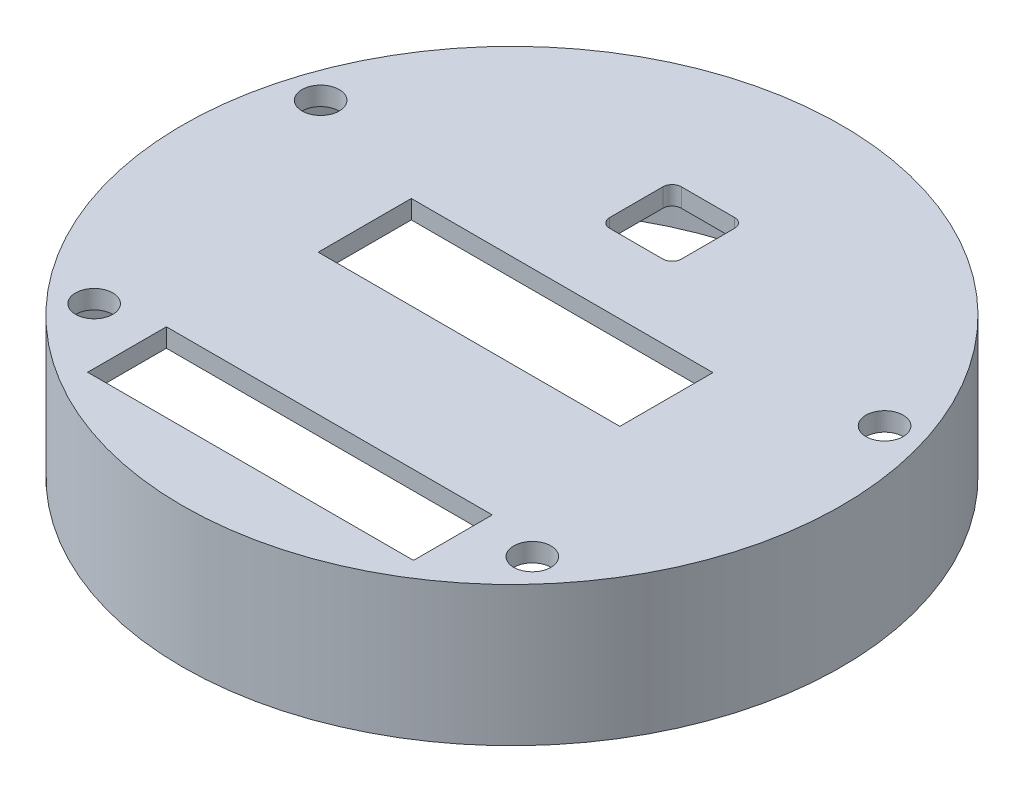
ISO-10303-21;
HEADER;
FILE_DESCRIPTION(('STEP AP214'),'2;1');
FILE_NAME('part.step','',(''),(''),'','','');
FILE_SCHEMA(('AUTOMOTIVE_DESIGN { 1 0 10303 214 1 1 1 1 }'));
ENDSEC;
DATA;
#1=APPLICATION_CONTEXT('core data for automotive mechanical design processes');
#2=APPLICATION_PROTOCOL_DEFINITION('international standard','automotive_design',2000,#1);
#3=PRODUCT_CONTEXT('',#1,'mechanical');
#4=PRODUCT('Part','Part','',(#3));
#5=PRODUCT_RELATED_PRODUCT_CATEGORY('part','',(#4));
#6=PRODUCT_DEFINITION_FORMATION('','',#4);
#7=PRODUCT_DEFINITION_CONTEXT('part definition',#1,'design');
#8=PRODUCT_DEFINITION('design','',#6,#7);
#9=PRODUCT_DEFINITION_SHAPE('','',#8);
#10=(LENGTH_UNIT() NAMED_UNIT(*) SI_UNIT(.MILLI.,.METRE.));
#11=(NAMED_UNIT(*) PLANE_ANGLE_UNIT() SI_UNIT($,.RADIAN.));
#12=(NAMED_UNIT(*) SI_UNIT($,.STERADIAN.) SOLID_ANGLE_UNIT());
#13=UNCERTAINTY_MEASURE_WITH_UNIT(LENGTH_MEASURE(1.E-05),#10,'distance_accuracy_value','');
#14=(GEOMETRIC_REPRESENTATION_CONTEXT(3) GLOBAL_UNCERTAINTY_ASSIGNED_CONTEXT((#13)) GLOBAL_UNIT_ASSIGNED_CONTEXT((#10,
#11,#12)) REPRESENTATION_CONTEXT('',''));
#15=CARTESIAN_POINT('',(0.,0.,0.));
#16=DIRECTION('',(0.,0.,1.));
#17=DIRECTION('',(1.,0.,0.));
#18=AXIS2_PLACEMENT_3D('',#15,#16,#17);
#19=CARTESIAN_POINT('',(0.,10.,0.));
#20=DIRECTION('',(0.,1.,0.));
#21=DIRECTION('',(0.,0.,1.));
#22=AXIS2_PLACEMENT_3D('',#19,#20,#21);
#23=PLANE('',#22);
#24=CARTESIAN_POINT('',(-14.2980458649045,10.,-71.7440671662427));
#25=DIRECTION('',(0.,-1.,0.));
#26=DIRECTION('',(0.,0.,-1.));
#27=AXIS2_PLACEMENT_3D('',#24,#25,#26);
#28=CIRCLE('',#27,4.99695413509549);
#29=CARTESIAN_POINT('',(-14.2980458649045,10.,-66.7471130311473));
#30=VERTEX_POINT('',#29);
#31=CARTESIAN_POINT('',(-19.295,10.,-71.7440671662427));
#32=VERTEX_POINT('',#31);
#33=EDGE_CURVE('E154',#30,#32,#28,.T.);
#34=ORIENTED_EDGE('',*,*,#33,.T.);
#35=DIRECTION('',(0.,0.,-1.));
#36=VECTOR('',#35,1.);
#37=CARTESIAN_POINT('',(-19.295,10.,-71.7440671662427));
#38=LINE('',#37,#36);
#39=CARTESIAN_POINT('',(-19.295,10.,-100.341395165584));
#40=VERTEX_POINT('',#39);
#41=EDGE_CURVE('E163',#32,#40,#38,.T.);
#42=ORIENTED_EDGE('',*,*,#41,.T.);
#43=CARTESIAN_POINT('',(-14.2992819814699,10.,-100.341395165584));
#44=DIRECTION('',(0.,-1.,0.));
#45=DIRECTION('',(0.,0.,-1.));
#46=AXIS2_PLACEMENT_3D('',#43,#44,#45);
#47=CIRCLE('',#46,4.99571801853014);
#48=CARTESIAN_POINT('',(-14.2980457119373,10.,-105.337113031147));
#49=VERTEX_POINT('',#48);
#50=EDGE_CURVE('E54',#40,#49,#47,.T.);
#51=ORIENTED_EDGE('',*,*,#50,.T.);
#52=DIRECTION('',(1.,0.,0.));
#53=VECTOR('',#52,1.);
#54=CARTESIAN_POINT('',(14.2993054193163,10.,-105.337113031147));
#55=LINE('',#54,#53);
#56=CARTESIAN_POINT('',(14.2993054193163,10.,-105.337113031147));
#57=VERTEX_POINT('',#56);
#58=EDGE_CURVE('E180',#49,#57,#55,.T.);
#59=ORIENTED_EDGE('',*,*,#58,.T.);
#60=CARTESIAN_POINT('',(14.299305266309,10.,-100.34141813875));
#61=DIRECTION('',(0.,-1.,0.));
#62=DIRECTION('',(0.,0.,1.));
#63=AXIS2_PLACEMENT_3D('',#60,#61,#62);
#64=CIRCLE('',#63,4.99569489239685);
#65=CARTESIAN_POINT('',(19.295,10.,-100.340158896052));
#66=VERTEX_POINT('',#65);
#67=EDGE_CURVE('E183',#57,#66,#64,.T.);
#68=ORIENTED_EDGE('',*,*,#67,.T.);
#69=DIRECTION('',(0.,0.,1.));
#70=VECTOR('',#69,1.);
#71=CARTESIAN_POINT('',(19.295,10.,-71.7440671662427));
#72=LINE('',#71,#70);
#73=CARTESIAN_POINT('',(19.295,10.,-71.7440671662427));
#74=VERTEX_POINT('',#73);
#75=EDGE_CURVE('E186',#66,#74,#72,.T.);
#76=ORIENTED_EDGE('',*,*,#75,.T.);
#77=CARTESIAN_POINT('',(14.2980458649045,10.,-71.7440671662427));
#78=DIRECTION('',(0.,-1.,0.));
#79=DIRECTION('',(0.,0.,1.));
#80=AXIS2_PLACEMENT_3D('',#77,#78,#79);
#81=CIRCLE('',#80,4.99695413509549);
#82=CARTESIAN_POINT('',(14.2980458649045,10.,-66.7471130311473));
#83=VERTEX_POINT('',#82);
#84=EDGE_CURVE('E189',#74,#83,#81,.T.);
#85=ORIENTED_EDGE('',*,*,#84,.T.);
#86=DIRECTION('',(-1.,0.,0.));
#87=VECTOR('',#86,1.);
#88=CARTESIAN_POINT('',(-14.2980458649045,10.,-66.7471130311473));
#89=LINE('',#88,#87);
#90=EDGE_CURVE('E160',#83,#30,#89,.T.);
#91=ORIENTED_EDGE('',*,*,#90,.T.);
#92=EDGE_LOOP('',(#34,#42,#51,#59,#68,#76,#85,#91));
#93=FACE_BOUND('',#92,.T.);
#94=CARTESIAN_POINT('',(-151.426262726326,10.,-48.6932363126054));
#95=DIRECTION('',(0.,-1.,0.));
#96=DIRECTION('',(0.,0.,-1.));
#97=AXIS2_PLACEMENT_3D('',#94,#95,#96);
#98=CIRCLE('',#97,10.);
#99=CARTESIAN_POINT('',(-151.426262726326,10.,-58.6932363126054));
#100=VERTEX_POINT('',#99);
#101=EDGE_CURVE('E275',#100,#100,#98,.T.);
#102=ORIENTED_EDGE('',*,*,#101,.T.);
#103=EDGE_LOOP('',(#102));
#104=FACE_BOUND('',#103,.T.);
#105=CARTESIAN_POINT('',(151.426262726326,10.,-48.6932363126054));
#106=DIRECTION('',(0.,-1.,0.));
#107=DIRECTION('',(0.,0.,-1.));
#108=AXIS2_PLACEMENT_3D('',#105,#106,#107);
#109=CIRCLE('',#108,10.);
#110=CARTESIAN_POINT('',(151.426262726326,10.,-58.6932363126054));
#111=VERTEX_POINT('',#110);
#112=EDGE_CURVE('E269',#111,#111,#109,.T.);
#113=ORIENTED_EDGE('',*,*,#112,.T.);
#114=EDGE_LOOP('',(#113));
#115=FACE_BOUND('',#114,.T.);
#116=CARTESIAN_POINT('',(117.665653331604,10.,106.7048628131));
#117=DIRECTION('',(0.,-1.,0.));
#118=DIRECTION('',(0.,0.,-1.));
#119=AXIS2_PLACEMENT_3D('',#116,#117,#118);
#120=CIRCLE('',#119,10.);
#121=CARTESIAN_POINT('',(117.665653331604,10.,96.7048628130998));
#122=VERTEX_POINT('',#121);
#123=EDGE_CURVE('E263',#122,#122,#120,.T.);
#124=ORIENTED_EDGE('',*,*,#123,.T.);
#125=EDGE_LOOP('',(#124));
#126=FACE_BOUND('',#125,.T.);
#127=CARTESIAN_POINT('',(-117.665653331604,10.,106.7048628131));
#128=DIRECTION('',(0.,-1.,0.));
#129=DIRECTION('',(0.,0.,-1.));
#130=AXIS2_PLACEMENT_3D('',#127,#128,#129);
#131=CIRCLE('',#130,9.99999999999999);
#132=CARTESIAN_POINT('',(-117.665653331604,10.,96.7048628130998));
#133=VERTEX_POINT('',#132);
#134=EDGE_CURVE('E241',#133,#133,#131,.T.);
#135=ORIENTED_EDGE('',*,*,#134,.T.);
#136=EDGE_LOOP('',(#135));
#137=FACE_BOUND('',#136,.T.);
#138=DIRECTION('',(0.,0.,-1.));
#139=VECTOR('',#138,1.);
#140=CARTESIAN_POINT('',(-87.5,10.,98.076429650903));
#141=LINE('',#140,#139);
#142=CARTESIAN_POINT('',(-87.5,10.,140.373739502711));
#143=VERTEX_POINT('',#142);
#144=CARTESIAN_POINT('',(-87.5,10.,98.076429650903));
#145=VERTEX_POINT('',#144);
#146=EDGE_CURVE('E224',#143,#145,#141,.T.);
#147=ORIENTED_EDGE('',*,*,#146,.T.);
#148=DIRECTION('',(1.,0.,0.));
#149=VECTOR('',#148,1.);
#150=CARTESIAN_POINT('',(-87.5,10.,98.076429650903));
#151=LINE('',#150,#149);
#152=CARTESIAN_POINT('',(87.5000000000001,10.,98.076429650903));
#153=VERTEX_POINT('',#152);
#154=EDGE_CURVE('E227',#145,#153,#151,.T.);
#155=ORIENTED_EDGE('',*,*,#154,.T.);
#156=DIRECTION('',(0.,0.,1.));
#157=VECTOR('',#156,1.);
#158=CARTESIAN_POINT('',(87.5000000000001,10.,98.076429650903));
#159=LINE('',#158,#157);
#160=CARTESIAN_POINT('',(87.5000000000001,10.,140.373739502711));
#161=VERTEX_POINT('',#160);
#162=EDGE_CURVE('E231',#153,#161,#159,.T.);
#163=ORIENTED_EDGE('',*,*,#162,.T.);
#164=DIRECTION('',(-1.,0.,0.));
#165=VECTOR('',#164,1.);
#166=CARTESIAN_POINT('',(-87.5,10.,140.373739502711));
#167=LINE('',#166,#165);
#168=EDGE_CURVE('E234',#161,#143,#167,.T.);
#169=ORIENTED_EDGE('',*,*,#168,.T.);
#170=EDGE_LOOP('',(#147,#155,#163,#169));
#171=FACE_BOUND('',#170,.T.);
#172=DIRECTION('',(0.,0.,-1.));
#173=VECTOR('',#172,1.);
#174=CARTESIAN_POINT('',(-81.4238002245838,10.,-27.3788553596633));
#175=LINE('',#174,#173);
#176=CARTESIAN_POINT('',(-81.4238002245838,10.,22.6211446403367));
#177=VERTEX_POINT('',#176);
#178=CARTESIAN_POINT('',(-81.4238002245838,10.,-27.3788553596633));
#179=VERTEX_POINT('',#178);
#180=EDGE_CURVE('E280',#177,#179,#175,.T.);
#181=ORIENTED_EDGE('',*,*,#180,.T.);
#182=DIRECTION('',(1.,0.,0.));
#183=VECTOR('',#182,1.);
#184=CARTESIAN_POINT('',(-81.4238002245838,10.,-27.3788553596633));
#185=LINE('',#184,#183);
#186=CARTESIAN_POINT('',(80.5761997754162,10.,-27.3788553596633));
#187=VERTEX_POINT('',#186);
#188=EDGE_CURVE('E283',#179,#187,#185,.T.);
#189=ORIENTED_EDGE('',*,*,#188,.T.);
#190=DIRECTION('',(0.,0.,1.));
#191=VECTOR('',#190,1.);
#192=CARTESIAN_POINT('',(80.5761997754162,10.,-27.3788553596633));
#193=LINE('',#192,#191);
#194=CARTESIAN_POINT('',(80.5761997754162,10.,22.6211446403367));
#195=VERTEX_POINT('',#194);
#196=EDGE_CURVE('E287',#187,#195,#193,.T.);
#197=ORIENTED_EDGE('',*,*,#196,.T.);
#198=DIRECTION('',(-1.,0.,0.));
#199=VECTOR('',#198,1.);
#200=CARTESIAN_POINT('',(-81.4238002245838,10.,22.6211446403367));
#201=LINE('',#200,#199);
#202=EDGE_CURVE('E290',#195,#177,#201,.T.);
#203=ORIENTED_EDGE('',*,*,#202,.T.);
#204=EDGE_LOOP('',(#181,#189,#197,#203));
#205=FACE_BOUND('',#204,.T.);
#206=CARTESIAN_POINT('',(0.,10.,0.));
#207=DIRECTION('',(0.,1.,0.));
#208=DIRECTION('',(0.,0.,1.));
#209=AXIS2_PLACEMENT_3D('',#206,#207,#208);
#210=CIRCLE('',#209,177.);
#211=CARTESIAN_POINT('',(0.,10.,177.));
#212=VERTEX_POINT('',#211);
#213=EDGE_CURVE('E449',#212,#212,#210,.T.);
#214=ORIENTED_EDGE('',*,*,#213,.T.);
#215=EDGE_LOOP('',(#214));
#216=FACE_BOUND('',#215,.T.);
#217=ADVANCED_FACE('F39',(#93,#104,#115,#126,#137,#171,#205,#216),#23,.T.);
#218=CARTESIAN_POINT('',(0.,0.,0.));
#219=DIRECTION('',(0.,1.,0.));
#220=DIRECTION('',(0.,0.,1.));
#221=AXIS2_PLACEMENT_3D('',#218,#219,#220);
#222=PLANE('',#221);
#223=DIRECTION('',(0.,0.,-1.));
#224=VECTOR('',#223,1.);
#225=CARTESIAN_POINT('',(-19.295,0.,-71.7440671662427));
#226=LINE('',#225,#224);
#227=CARTESIAN_POINT('',(-19.295,0.,-71.7440671662427));
#228=VERTEX_POINT('',#227);
#229=CARTESIAN_POINT('',(-19.295,0.,-100.341395165584));
#230=VERTEX_POINT('',#229);
#231=EDGE_CURVE('E193',#228,#230,#226,.T.);
#232=ORIENTED_EDGE('',*,*,#231,.F.);
#233=CARTESIAN_POINT('',(-14.2980458649045,0.,-71.7440671662427));
#234=DIRECTION('',(0.,-1.,0.));
#235=DIRECTION('',(0.,0.,-1.));
#236=AXIS2_PLACEMENT_3D('',#233,#234,#235);
#237=CIRCLE('',#236,4.99695413509549);
#238=CARTESIAN_POINT('',(-14.2980458649045,0.,-66.7471130311473));
#239=VERTEX_POINT('',#238);
#240=EDGE_CURVE('E62',#239,#228,#237,.T.);
#241=ORIENTED_EDGE('',*,*,#240,.F.);
#242=DIRECTION('',(-1.,0.,0.));
#243=VECTOR('',#242,1.);
#244=CARTESIAN_POINT('',(-14.2980458649045,0.,-66.7471130311473));
#245=LINE('',#244,#243);
#246=CARTESIAN_POINT('',(14.2980458649045,0.,-66.7471130311473));
#247=VERTEX_POINT('',#246);
#248=EDGE_CURVE('E170',#247,#239,#245,.T.);
#249=ORIENTED_EDGE('',*,*,#248,.F.);
#250=CARTESIAN_POINT('',(14.2980458649045,0.,-71.7440671662427));
#251=DIRECTION('',(0.,-1.,0.));
#252=DIRECTION('',(0.,0.,1.));
#253=AXIS2_PLACEMENT_3D('',#250,#251,#252);
#254=CIRCLE('',#253,4.99695413509549);
#255=CARTESIAN_POINT('',(19.295,0.,-71.7440671662427));
#256=VERTEX_POINT('',#255);
#257=EDGE_CURVE('E173',#256,#247,#254,.T.);
#258=ORIENTED_EDGE('',*,*,#257,.F.);
#259=DIRECTION('',(0.,0.,1.));
#260=VECTOR('',#259,1.);
#261=CARTESIAN_POINT('',(19.295,0.,-71.7440671662427));
#262=LINE('',#261,#260);
#263=CARTESIAN_POINT('',(19.295,0.,-100.340158896052));
#264=VERTEX_POINT('',#263);
#265=EDGE_CURVE('E205',#264,#256,#262,.T.);
#266=ORIENTED_EDGE('',*,*,#265,.F.);
#267=CARTESIAN_POINT('',(14.299305266309,0.,-100.34141813875));
#268=DIRECTION('',(0.,-1.,0.));
#269=DIRECTION('',(0.,0.,1.));
#270=AXIS2_PLACEMENT_3D('',#267,#268,#269);
#271=CIRCLE('',#270,4.99569489239685);
#272=CARTESIAN_POINT('',(14.2993054193163,0.,-105.337113031147));
#273=VERTEX_POINT('',#272);
#274=EDGE_CURVE('E202',#273,#264,#271,.T.);
#275=ORIENTED_EDGE('',*,*,#274,.F.);
#276=DIRECTION('',(1.,0.,0.));
#277=VECTOR('',#276,1.);
#278=CARTESIAN_POINT('',(14.2993054193163,0.,-105.337113031147));
#279=LINE('',#278,#277);
#280=CARTESIAN_POINT('',(-14.2980457119373,0.,-105.337113031147));
#281=VERTEX_POINT('',#280);
#282=EDGE_CURVE('E199',#281,#273,#279,.T.);
#283=ORIENTED_EDGE('',*,*,#282,.F.);
#284=CARTESIAN_POINT('',(-14.2992819814699,0.,-100.341395165584));
#285=DIRECTION('',(0.,-1.,0.));
#286=DIRECTION('',(0.,0.,-1.));
#287=AXIS2_PLACEMENT_3D('',#284,#285,#286);
#288=CIRCLE('',#287,4.99571801853014);
#289=EDGE_CURVE('E196',#230,#281,#288,.T.);
#290=ORIENTED_EDGE('',*,*,#289,.F.);
#291=EDGE_LOOP('',(#232,#241,#249,#258,#266,#275,#283,#290));
#292=FACE_BOUND('',#291,.T.);
#293=CARTESIAN_POINT('',(-151.426262726326,0.,-48.6932363126054));
#294=DIRECTION('',(0.,-1.,0.));
#295=DIRECTION('',(0.,0.,-1.));
#296=AXIS2_PLACEMENT_3D('',#293,#294,#295);
#297=CIRCLE('',#296,10.);
#298=CARTESIAN_POINT('',(-151.426262726326,0.,-58.6932363126054));
#299=VERTEX_POINT('',#298);
#300=EDGE_CURVE('E212',#299,#299,#297,.T.);
#301=ORIENTED_EDGE('',*,*,#300,.F.);
#302=EDGE_LOOP('',(#301));
#303=FACE_BOUND('',#302,.T.);
#304=CARTESIAN_POINT('',(151.426262726326,0.,-48.6932363126054));
#305=DIRECTION('',(0.,-1.,0.));
#306=DIRECTION('',(0.,0.,-1.));
#307=AXIS2_PLACEMENT_3D('',#304,#305,#306);
#308=CIRCLE('',#307,10.);
#309=CARTESIAN_POINT('',(151.426262726326,0.,-58.6932363126054));
#310=VERTEX_POINT('',#309);
#311=EDGE_CURVE('E272',#310,#310,#308,.T.);
#312=ORIENTED_EDGE('',*,*,#311,.F.);
#313=EDGE_LOOP('',(#312));
#314=FACE_BOUND('',#313,.T.);
#315=CARTESIAN_POINT('',(117.665653331604,0.,106.7048628131));
#316=DIRECTION('',(0.,-1.,0.));
#317=DIRECTION('',(0.,0.,-1.));
#318=AXIS2_PLACEMENT_3D('',#315,#316,#317);
#319=CIRCLE('',#318,10.);
#320=CARTESIAN_POINT('',(117.665653331604,0.,96.7048628130998));
#321=VERTEX_POINT('',#320);
#322=EDGE_CURVE('E266',#321,#321,#319,.T.);
#323=ORIENTED_EDGE('',*,*,#322,.F.);
#324=EDGE_LOOP('',(#323));
#325=FACE_BOUND('',#324,.T.);
#326=CARTESIAN_POINT('',(-117.665653331604,0.,106.7048628131));
#327=DIRECTION('',(0.,-1.,0.));
#328=DIRECTION('',(0.,0.,-1.));
#329=AXIS2_PLACEMENT_3D('',#326,#327,#328);
#330=CIRCLE('',#329,9.99999999999999);
#331=CARTESIAN_POINT('',(-117.665653331604,0.,96.7048628130998));
#332=VERTEX_POINT('',#331);
#333=EDGE_CURVE('E260',#332,#332,#330,.T.);
#334=ORIENTED_EDGE('',*,*,#333,.F.);
#335=EDGE_LOOP('',(#334));
#336=FACE_BOUND('',#335,.T.);
#337=DIRECTION('',(1.,0.,0.));
#338=VECTOR('',#337,1.);
#339=CARTESIAN_POINT('',(-87.5,0.,98.076429650903));
#340=LINE('',#339,#338);
#341=CARTESIAN_POINT('',(-87.5,0.,98.076429650903));
#342=VERTEX_POINT('',#341);
#343=CARTESIAN_POINT('',(87.5000000000001,0.,98.076429650903));
#344=VERTEX_POINT('',#343);
#345=EDGE_CURVE('E240',#342,#344,#340,.T.);
#346=ORIENTED_EDGE('',*,*,#345,.F.);
#347=DIRECTION('',(0.,0.,-1.));
#348=VECTOR('',#347,1.);
#349=CARTESIAN_POINT('',(-87.5,0.,98.076429650903));
#350=LINE('',#349,#348);
#351=CARTESIAN_POINT('',(-87.5,0.,140.373739502711));
#352=VERTEX_POINT('',#351);
#353=EDGE_CURVE('E238',#352,#342,#350,.T.);
#354=ORIENTED_EDGE('',*,*,#353,.F.);
#355=DIRECTION('',(-1.,0.,0.));
#356=VECTOR('',#355,1.);
#357=CARTESIAN_POINT('',(-87.5,0.,140.373739502711));
#358=LINE('',#357,#356);
#359=CARTESIAN_POINT('',(87.5000000000001,0.,140.373739502711));
#360=VERTEX_POINT('',#359);
#361=EDGE_CURVE('E228',#360,#352,#358,.T.);
#362=ORIENTED_EDGE('',*,*,#361,.F.);
#363=DIRECTION('',(0.,0.,1.));
#364=VECTOR('',#363,1.);
#365=CARTESIAN_POINT('',(87.5000000000001,0.,98.076429650903));
#366=LINE('',#365,#364);
#367=EDGE_CURVE('E244',#344,#360,#366,.T.);
#368=ORIENTED_EDGE('',*,*,#367,.F.);
#369=EDGE_LOOP('',(#346,#354,#362,#368));
#370=FACE_BOUND('',#369,.T.);
#371=DIRECTION('',(1.,0.,0.));
#372=VECTOR('',#371,1.);
#373=CARTESIAN_POINT('',(-81.4238002245838,0.,-27.3788553596633));
#374=LINE('',#373,#372);
#375=CARTESIAN_POINT('',(-81.4238002245838,0.,-27.3788553596633));
#376=VERTEX_POINT('',#375);
#377=CARTESIAN_POINT('',(80.5761997754162,0.,-27.3788553596633));
#378=VERTEX_POINT('',#377);
#379=EDGE_CURVE('E295',#376,#378,#374,.T.);
#380=ORIENTED_EDGE('',*,*,#379,.F.);
#381=DIRECTION('',(0.,0.,-1.));
#382=VECTOR('',#381,1.);
#383=CARTESIAN_POINT('',(-81.4238002245838,0.,-27.3788553596633));
#384=LINE('',#383,#382);
#385=CARTESIAN_POINT('',(-81.4238002245838,0.,22.6211446403367));
#386=VERTEX_POINT('',#385);
#387=EDGE_CURVE('E251',#386,#376,#384,.T.);
#388=ORIENTED_EDGE('',*,*,#387,.F.);
#389=DIRECTION('',(-1.,0.,0.));
#390=VECTOR('',#389,1.);
#391=CARTESIAN_POINT('',(-81.4238002245838,0.,22.6211446403367));
#392=LINE('',#391,#390);
#393=CARTESIAN_POINT('',(80.5761997754162,0.,22.6211446403367));
#394=VERTEX_POINT('',#393);
#395=EDGE_CURVE('E284',#394,#386,#392,.T.);
#396=ORIENTED_EDGE('',*,*,#395,.F.);
#397=DIRECTION('',(0.,0.,1.));
#398=VECTOR('',#397,1.);
#399=CARTESIAN_POINT('',(80.5761997754162,0.,-27.3788553596633));
#400=LINE('',#399,#398);
#401=EDGE_CURVE('E298',#378,#394,#400,.T.);
#402=ORIENTED_EDGE('',*,*,#401,.F.);
#403=EDGE_LOOP('',(#380,#388,#396,#402));
#404=FACE_BOUND('',#403,.T.);
#405=CARTESIAN_POINT('',(0.,0.,0.));
#406=DIRECTION('',(0.,1.,0.));
#407=DIRECTION('',(0.,0.,1.));
#408=AXIS2_PLACEMENT_3D('',#405,#406,#407);
#409=CIRCLE('',#408,175.);
#410=CARTESIAN_POINT('',(0.,0.,175.));
#411=VERTEX_POINT('',#410);
#412=EDGE_CURVE('E11',#411,#411,#409,.T.);
#413=ORIENTED_EDGE('',*,*,#412,.F.);
#414=EDGE_LOOP('',(#413));
#415=FACE_BOUND('',#414,.T.);
#416=ADVANCED_FACE('F41',(#292,#303,#314,#325,#336,#370,#404,#415),#222,.F.);
#417=CARTESIAN_POINT('',(-81.4238002245838,10.,-27.3788553596633));
#418=DIRECTION('',(-1.,0.,0.));
#419=DIRECTION('',(0.,0.,1.));
#420=AXIS2_PLACEMENT_3D('',#417,#418,#419);
#421=PLANE('',#420);
#422=ORIENTED_EDGE('',*,*,#387,.T.);
#423=DIRECTION('',(0.,-1.,0.));
#424=VECTOR('',#423,1.);
#425=CARTESIAN_POINT('',(-81.4238002245838,10.,-27.3788553596633));
#426=LINE('',#425,#424);
#427=EDGE_CURVE('E293',#179,#376,#426,.T.);
#428=ORIENTED_EDGE('',*,*,#427,.F.);
#429=ORIENTED_EDGE('',*,*,#180,.F.);
#430=DIRECTION('',(0.,-1.,0.));
#431=VECTOR('',#430,1.);
#432=CARTESIAN_POINT('',(-81.4238002245838,10.,22.6211446403367));
#433=LINE('',#432,#431);
#434=EDGE_CURVE('E47',#177,#386,#433,.T.);
#435=ORIENTED_EDGE('',*,*,#434,.T.);
#436=EDGE_LOOP('',(#422,#428,#429,#435));
#437=FACE_BOUND('',#436,.T.);
#438=ADVANCED_FACE('F325',(#437),#421,.F.);
#439=CARTESIAN_POINT('',(-81.4238002245838,10.,22.6211446403367));
#440=DIRECTION('',(0.,0.,1.));
#441=DIRECTION('',(1.,0.,0.));
#442=AXIS2_PLACEMENT_3D('',#439,#440,#441);
#443=PLANE('',#442);
#444=ORIENTED_EDGE('',*,*,#395,.T.);
#445=ORIENTED_EDGE('',*,*,#434,.F.);
#446=ORIENTED_EDGE('',*,*,#202,.F.);
#447=DIRECTION('',(0.,-1.,0.));
#448=VECTOR('',#447,1.);
#449=CARTESIAN_POINT('',(80.5761997754162,10.,22.6211446403367));
#450=LINE('',#449,#448);
#451=EDGE_CURVE('E304',#195,#394,#450,.T.);
#452=ORIENTED_EDGE('',*,*,#451,.T.);
#453=EDGE_LOOP('',(#444,#445,#446,#452));
#454=FACE_BOUND('',#453,.T.);
#455=ADVANCED_FACE('F327',(#454),#443,.F.);
#456=CARTESIAN_POINT('',(80.5761997754162,10.,-27.3788553596633));
#457=DIRECTION('',(1.,0.,0.));
#458=DIRECTION('',(0.,0.,-1.));
#459=AXIS2_PLACEMENT_3D('',#456,#457,#458);
#460=PLANE('',#459);
#461=ORIENTED_EDGE('',*,*,#401,.T.);
#462=ORIENTED_EDGE('',*,*,#451,.F.);
#463=ORIENTED_EDGE('',*,*,#196,.F.);
#464=DIRECTION('',(0.,-1.,0.));
#465=VECTOR('',#464,1.);
#466=CARTESIAN_POINT('',(80.5761997754162,10.,-27.3788553596633));
#467=LINE('',#466,#465);
#468=EDGE_CURVE('E306',#187,#378,#467,.T.);
#469=ORIENTED_EDGE('',*,*,#468,.T.);
#470=EDGE_LOOP('',(#461,#462,#463,#469));
#471=FACE_BOUND('',#470,.T.);
#472=ADVANCED_FACE('F321',(#471),#460,.F.);
#473=CARTESIAN_POINT('',(-81.4238002245838,10.,-27.3788553596633));
#474=DIRECTION('',(0.,0.,-1.));
#475=DIRECTION('',(-1.,0.,0.));
#476=AXIS2_PLACEMENT_3D('',#473,#474,#475);
#477=PLANE('',#476);
#478=ORIENTED_EDGE('',*,*,#379,.T.);
#479=ORIENTED_EDGE('',*,*,#468,.F.);
#480=ORIENTED_EDGE('',*,*,#188,.F.);
#481=ORIENTED_EDGE('',*,*,#427,.T.);
#482=EDGE_LOOP('',(#478,#479,#480,#481));
#483=FACE_BOUND('',#482,.T.);
#484=ADVANCED_FACE('F311',(#483),#477,.F.);
#485=CARTESIAN_POINT('',(-87.5,10.,98.076429650903));
#486=DIRECTION('',(-1.,0.,0.));
#487=DIRECTION('',(0.,0.,1.));
#488=AXIS2_PLACEMENT_3D('',#485,#486,#487);
#489=PLANE('',#488);
#490=ORIENTED_EDGE('',*,*,#353,.T.);
#491=DIRECTION('',(0.,-1.,0.));
#492=VECTOR('',#491,1.);
#493=CARTESIAN_POINT('',(-87.5,10.,98.076429650903));
#494=LINE('',#493,#492);
#495=EDGE_CURVE('E237',#145,#342,#494,.T.);
#496=ORIENTED_EDGE('',*,*,#495,.F.);
#497=ORIENTED_EDGE('',*,*,#146,.F.);
#498=DIRECTION('',(0.,-1.,0.));
#499=VECTOR('',#498,1.);
#500=CARTESIAN_POINT('',(-87.5,10.,140.373739502711));
#501=LINE('',#500,#499);
#502=EDGE_CURVE('E249',#143,#352,#501,.T.);
#503=ORIENTED_EDGE('',*,*,#502,.T.);
#504=EDGE_LOOP('',(#490,#496,#497,#503));
#505=FACE_BOUND('',#504,.T.);
#506=ADVANCED_FACE('F346',(#505),#489,.F.);
#507=CARTESIAN_POINT('',(-87.5,10.,140.373739502711));
#508=DIRECTION('',(0.,0.,1.));
#509=DIRECTION('',(1.,0.,0.));
#510=AXIS2_PLACEMENT_3D('',#507,#508,#509);
#511=PLANE('',#510);
#512=ORIENTED_EDGE('',*,*,#361,.T.);
#513=ORIENTED_EDGE('',*,*,#502,.F.);
#514=ORIENTED_EDGE('',*,*,#168,.F.);
#515=DIRECTION('',(0.,-1.,0.));
#516=VECTOR('',#515,1.);
#517=CARTESIAN_POINT('',(87.5000000000001,10.,140.373739502711));
#518=LINE('',#517,#516);
#519=EDGE_CURVE('E252',#161,#360,#518,.T.);
#520=ORIENTED_EDGE('',*,*,#519,.T.);
#521=EDGE_LOOP('',(#512,#513,#514,#520));
#522=FACE_BOUND('',#521,.T.);
#523=ADVANCED_FACE('F350',(#522),#511,.F.);
#524=CARTESIAN_POINT('',(87.5000000000001,10.,98.076429650903));
#525=DIRECTION('',(1.,0.,0.));
#526=DIRECTION('',(0.,0.,-1.));
#527=AXIS2_PLACEMENT_3D('',#524,#525,#526);
#528=PLANE('',#527);
#529=ORIENTED_EDGE('',*,*,#367,.T.);
#530=ORIENTED_EDGE('',*,*,#519,.F.);
#531=ORIENTED_EDGE('',*,*,#162,.F.);
#532=DIRECTION('',(0.,-1.,0.));
#533=VECTOR('',#532,1.);
#534=CARTESIAN_POINT('',(87.5000000000001,10.,98.076429650903));
#535=LINE('',#534,#533);
#536=EDGE_CURVE('E254',#153,#344,#535,.T.);
#537=ORIENTED_EDGE('',*,*,#536,.T.);
#538=EDGE_LOOP('',(#529,#530,#531,#537));
#539=FACE_BOUND('',#538,.T.);
#540=ADVANCED_FACE('F356',(#539),#528,.F.);
#541=CARTESIAN_POINT('',(-87.5,10.,98.076429650903));
#542=DIRECTION('',(0.,0.,-1.));
#543=DIRECTION('',(-1.,0.,0.));
#544=AXIS2_PLACEMENT_3D('',#541,#542,#543);
#545=PLANE('',#544);
#546=ORIENTED_EDGE('',*,*,#345,.T.);
#547=ORIENTED_EDGE('',*,*,#536,.F.);
#548=ORIENTED_EDGE('',*,*,#154,.F.);
#549=ORIENTED_EDGE('',*,*,#495,.T.);
#550=EDGE_LOOP('',(#546,#547,#548,#549));
#551=FACE_BOUND('',#550,.T.);
#552=ADVANCED_FACE('F361',(#551),#545,.F.);
#553=CARTESIAN_POINT('',(-117.665653331604,10.,106.7048628131));
#554=DIRECTION('',(0.,-1.,0.));
#555=DIRECTION('',(0.,0.,-1.));
#556=AXIS2_PLACEMENT_3D('',#553,#554,#555);
#557=CYLINDRICAL_SURFACE('',#556,9.99999999999999);
#558=ORIENTED_EDGE('',*,*,#134,.F.);
#559=EDGE_LOOP('',(#558));
#560=FACE_BOUND('',#559,.T.);
#561=ORIENTED_EDGE('',*,*,#333,.T.);
#562=EDGE_LOOP('',(#561));
#563=FACE_BOUND('',#562,.T.);
#564=ADVANCED_FACE('F363',(#560,#563),#557,.F.);
#565=CARTESIAN_POINT('',(117.665653331604,10.,106.7048628131));
#566=DIRECTION('',(0.,-1.,0.));
#567=DIRECTION('',(0.,0.,-1.));
#568=AXIS2_PLACEMENT_3D('',#565,#566,#567);
#569=CYLINDRICAL_SURFACE('',#568,10.);
#570=ORIENTED_EDGE('',*,*,#123,.F.);
#571=EDGE_LOOP('',(#570));
#572=FACE_BOUND('',#571,.T.);
#573=ORIENTED_EDGE('',*,*,#322,.T.);
#574=EDGE_LOOP('',(#573));
#575=FACE_BOUND('',#574,.T.);
#576=ADVANCED_FACE('F366',(#572,#575),#569,.F.);
#577=CARTESIAN_POINT('',(151.426262726326,10.,-48.6932363126054));
#578=DIRECTION('',(0.,-1.,0.));
#579=DIRECTION('',(0.,0.,-1.));
#580=AXIS2_PLACEMENT_3D('',#577,#578,#579);
#581=CYLINDRICAL_SURFACE('',#580,10.);
#582=ORIENTED_EDGE('',*,*,#112,.F.);
#583=EDGE_LOOP('',(#582));
#584=FACE_BOUND('',#583,.T.);
#585=ORIENTED_EDGE('',*,*,#311,.T.);
#586=EDGE_LOOP('',(#585));
#587=FACE_BOUND('',#586,.T.);
#588=ADVANCED_FACE('F370',(#584,#587),#581,.F.);
#589=CARTESIAN_POINT('',(-151.426262726326,10.,-48.6932363126054));
#590=DIRECTION('',(0.,-1.,0.));
#591=DIRECTION('',(0.,0.,-1.));
#592=AXIS2_PLACEMENT_3D('',#589,#590,#591);
#593=CYLINDRICAL_SURFACE('',#592,10.);
#594=ORIENTED_EDGE('',*,*,#101,.F.);
#595=EDGE_LOOP('',(#594));
#596=FACE_BOUND('',#595,.T.);
#597=ORIENTED_EDGE('',*,*,#300,.T.);
#598=EDGE_LOOP('',(#597));
#599=FACE_BOUND('',#598,.T.);
#600=ADVANCED_FACE('F373',(#596,#599),#593,.F.);
#601=CARTESIAN_POINT('',(-14.2980458649045,10.,-71.7440671662427));
#602=DIRECTION('',(0.,-1.,0.));
#603=DIRECTION('',(0.,0.,-1.));
#604=AXIS2_PLACEMENT_3D('',#601,#602,#603);
#605=CYLINDRICAL_SURFACE('',#604,4.99695413509549);
#606=ORIENTED_EDGE('',*,*,#240,.T.);
#607=DIRECTION('',(0.,-1.,0.));
#608=VECTOR('',#607,1.);
#609=CARTESIAN_POINT('',(-19.295,10.,-71.7440671662427));
#610=LINE('',#609,#608);
#611=EDGE_CURVE('E150',#32,#228,#610,.T.);
#612=ORIENTED_EDGE('',*,*,#611,.F.);
#613=ORIENTED_EDGE('',*,*,#33,.F.);
#614=DIRECTION('',(0.,-1.,0.));
#615=VECTOR('',#614,1.);
#616=CARTESIAN_POINT('',(-14.2980458649045,10.,-66.7471130311473));
#617=LINE('',#616,#615);
#618=EDGE_CURVE('E210',#30,#239,#617,.T.);
#619=ORIENTED_EDGE('',*,*,#618,.T.);
#620=EDGE_LOOP('',(#606,#612,#613,#619));
#621=FACE_BOUND('',#620,.T.);
#622=ADVANCED_FACE('F152',(#621),#605,.F.);
#623=CARTESIAN_POINT('',(-14.2980458649045,10.,-66.7471130311473));
#624=DIRECTION('',(0.,0.,1.));
#625=DIRECTION('',(1.,0.,0.));
#626=AXIS2_PLACEMENT_3D('',#623,#624,#625);
#627=PLANE('',#626);
#628=ORIENTED_EDGE('',*,*,#248,.T.);
#629=ORIENTED_EDGE('',*,*,#618,.F.);
#630=ORIENTED_EDGE('',*,*,#90,.F.);
#631=DIRECTION('',(0.,-1.,0.));
#632=VECTOR('',#631,1.);
#633=CARTESIAN_POINT('',(14.2980458649045,10.,-66.7471130311473));
#634=LINE('',#633,#632);
#635=EDGE_CURVE('E213',#83,#247,#634,.T.);
#636=ORIENTED_EDGE('',*,*,#635,.T.);
#637=EDGE_LOOP('',(#628,#629,#630,#636));
#638=FACE_BOUND('',#637,.T.);
#639=ADVANCED_FACE('F380',(#638),#627,.F.);
#640=CARTESIAN_POINT('',(14.2980458649045,10.,-71.7440671662427));
#641=DIRECTION('',(0.,-1.,0.));
#642=DIRECTION('',(0.,0.,-1.));
#643=AXIS2_PLACEMENT_3D('',#640,#641,#642);
#644=CYLINDRICAL_SURFACE('',#643,4.99695413509549);
#645=ORIENTED_EDGE('',*,*,#257,.T.);
#646=ORIENTED_EDGE('',*,*,#635,.F.);
#647=ORIENTED_EDGE('',*,*,#84,.F.);
#648=DIRECTION('',(0.,-1.,0.));
#649=VECTOR('',#648,1.);
#650=CARTESIAN_POINT('',(19.295,10.,-71.7440671662427));
#651=LINE('',#650,#649);
#652=EDGE_CURVE('E215',#74,#256,#651,.T.);
#653=ORIENTED_EDGE('',*,*,#652,.T.);
#654=EDGE_LOOP('',(#645,#646,#647,#653));
#655=FACE_BOUND('',#654,.T.);
#656=ADVANCED_FACE('F425',(#655),#644,.F.);
#657=CARTESIAN_POINT('',(19.295,10.,-71.7440671662427));
#658=DIRECTION('',(1.,0.,0.));
#659=DIRECTION('',(0.,0.,-1.));
#660=AXIS2_PLACEMENT_3D('',#657,#658,#659);
#661=PLANE('',#660);
#662=ORIENTED_EDGE('',*,*,#265,.T.);
#663=ORIENTED_EDGE('',*,*,#652,.F.);
#664=ORIENTED_EDGE('',*,*,#75,.F.);
#665=DIRECTION('',(0.,-1.,0.));
#666=VECTOR('',#665,1.);
#667=CARTESIAN_POINT('',(19.295,10.,-100.340158896052));
#668=LINE('',#667,#666);
#669=EDGE_CURVE('E217',#66,#264,#668,.T.);
#670=ORIENTED_EDGE('',*,*,#669,.T.);
#671=EDGE_LOOP('',(#662,#663,#664,#670));
#672=FACE_BOUND('',#671,.T.);
#673=ADVANCED_FACE('F421',(#672),#661,.F.);
#674=CARTESIAN_POINT('',(14.299305266309,10.,-100.34141813875));
#675=DIRECTION('',(0.,-1.,0.));
#676=DIRECTION('',(0.,0.,-1.));
#677=AXIS2_PLACEMENT_3D('',#674,#675,#676);
#678=CYLINDRICAL_SURFACE('',#677,4.99569489239685);
#679=ORIENTED_EDGE('',*,*,#274,.T.);
#680=ORIENTED_EDGE('',*,*,#669,.F.);
#681=ORIENTED_EDGE('',*,*,#67,.F.);
#682=DIRECTION('',(0.,-1.,0.));
#683=VECTOR('',#682,1.);
#684=CARTESIAN_POINT('',(14.2993054193163,10.,-105.337113031147));
#685=LINE('',#684,#683);
#686=EDGE_CURVE('E219',#57,#273,#685,.T.);
#687=ORIENTED_EDGE('',*,*,#686,.T.);
#688=EDGE_LOOP('',(#679,#680,#681,#687));
#689=FACE_BOUND('',#688,.T.);
#690=ADVANCED_FACE('F417',(#689),#678,.F.);
#691=CARTESIAN_POINT('',(14.2993054193163,10.,-105.337113031147));
#692=DIRECTION('',(0.,0.,-1.));
#693=DIRECTION('',(-1.,0.,0.));
#694=AXIS2_PLACEMENT_3D('',#691,#692,#693);
#695=PLANE('',#694);
#696=ORIENTED_EDGE('',*,*,#282,.T.);
#697=ORIENTED_EDGE('',*,*,#686,.F.);
#698=ORIENTED_EDGE('',*,*,#58,.F.);
#699=DIRECTION('',(0.,-1.,0.));
#700=VECTOR('',#699,1.);
#701=CARTESIAN_POINT('',(-14.2980457119373,10.,-105.337113031147));
#702=LINE('',#701,#700);
#703=EDGE_CURVE('E221',#49,#281,#702,.T.);
#704=ORIENTED_EDGE('',*,*,#703,.T.);
#705=EDGE_LOOP('',(#696,#697,#698,#704));
#706=FACE_BOUND('',#705,.T.);
#707=ADVANCED_FACE('F414',(#706),#695,.F.);
#708=CARTESIAN_POINT('',(-14.2992819814699,10.,-100.341395165584));
#709=DIRECTION('',(0.,-1.,0.));
#710=DIRECTION('',(0.,0.,-1.));
#711=AXIS2_PLACEMENT_3D('',#708,#709,#710);
#712=CYLINDRICAL_SURFACE('',#711,4.99571801853014);
#713=ORIENTED_EDGE('',*,*,#289,.T.);
#714=ORIENTED_EDGE('',*,*,#703,.F.);
#715=ORIENTED_EDGE('',*,*,#50,.F.);
#716=DIRECTION('',(0.,-1.,0.));
#717=VECTOR('',#716,1.);
#718=CARTESIAN_POINT('',(-19.295,10.,-100.341395165584));
#719=LINE('',#718,#717);
#720=EDGE_CURVE('E159',#40,#230,#719,.T.);
#721=ORIENTED_EDGE('',*,*,#720,.T.);
#722=EDGE_LOOP('',(#713,#714,#715,#721));
#723=FACE_BOUND('',#722,.T.);
#724=ADVANCED_FACE('F411',(#723),#712,.F.);
#725=CARTESIAN_POINT('',(-19.295,10.,-71.7440671662427));
#726=DIRECTION('',(-1.,0.,0.));
#727=DIRECTION('',(0.,0.,1.));
#728=AXIS2_PLACEMENT_3D('',#725,#726,#727);
#729=PLANE('',#728);
#730=ORIENTED_EDGE('',*,*,#231,.T.);
#731=ORIENTED_EDGE('',*,*,#720,.F.);
#732=ORIENTED_EDGE('',*,*,#41,.F.);
#733=ORIENTED_EDGE('',*,*,#611,.T.);
#734=EDGE_LOOP('',(#730,#731,#732,#733));
#735=FACE_BOUND('',#734,.T.);
#736=ADVANCED_FACE('F164',(#735),#729,.F.);
#737=CARTESIAN_POINT('',(0.,-565.631601080076,0.));
#738=DIRECTION('',(0.,1.,0.));
#739=DIRECTION('',(0.,0.,1.));
#740=AXIS2_PLACEMENT_3D('',#737,#738,#739);
#741=CYLINDRICAL_SURFACE('',#740,175.);
#742=CARTESIAN_POINT('',(0.,-64.9999999999999,0.));
#743=DIRECTION('',(0.,1.,0.));
#744=DIRECTION('',(0.,0.,1.));
#745=AXIS2_PLACEMENT_3D('',#742,#743,#744);
#746=CIRCLE('',#745,175.);
#747=CARTESIAN_POINT('',(0.,-64.9999999999999,175.));
#748=VERTEX_POINT('',#747);
#749=EDGE_CURVE('E176',#748,#748,#746,.F.);
#750=ORIENTED_EDGE('',*,*,#749,.T.);
#751=EDGE_LOOP('',(#750));
#752=FACE_BOUND('',#751,.T.);
#753=ORIENTED_EDGE('',*,*,#412,.T.);
#754=EDGE_LOOP('',(#753));
#755=FACE_BOUND('',#754,.T.);
#756=ADVANCED_FACE('F410',(#752,#755),#741,.F.);
#757=CARTESIAN_POINT('',(0.,-565.631601080076,0.));
#758=DIRECTION('',(0.,1.,0.));
#759=DIRECTION('',(0.,0.,1.));
#760=AXIS2_PLACEMENT_3D('',#757,#758,#759);
#761=CYLINDRICAL_SURFACE('',#760,177.);
#762=CARTESIAN_POINT('',(0.,-64.9999999999999,0.));
#763=DIRECTION('',(0.,1.,0.));
#764=DIRECTION('',(0.,0.,1.));
#765=AXIS2_PLACEMENT_3D('',#762,#763,#764);
#766=CIRCLE('',#765,177.);
#767=CARTESIAN_POINT('',(0.,-64.9999999999999,177.));
#768=VERTEX_POINT('',#767);
#769=EDGE_CURVE('E194',#768,#768,#766,.F.);
#770=ORIENTED_EDGE('',*,*,#769,.F.);
#771=EDGE_LOOP('',(#770));
#772=FACE_BOUND('',#771,.T.);
#773=ORIENTED_EDGE('',*,*,#213,.F.);
#774=EDGE_LOOP('',(#773));
#775=FACE_BOUND('',#774,.T.);
#776=ADVANCED_FACE('F433',(#772,#775),#761,.T.);
#777=CARTESIAN_POINT('',(0.717914221643906,-65.,-16.187356575127));
#778=DIRECTION('',(0.,1.,0.));
#779=DIRECTION('',(0.,0.,1.));
#780=AXIS2_PLACEMENT_3D('',#777,#778,#779);
#781=PLANE('',#780);
#782=ORIENTED_EDGE('',*,*,#769,.T.);
#783=EDGE_LOOP('',(#782));
#784=FACE_BOUND('',#783,.T.);
#785=ORIENTED_EDGE('',*,*,#749,.F.);
#786=EDGE_LOOP('',(#785));
#787=FACE_BOUND('',#786,.T.);
#788=ADVANCED_FACE('F436',(#784,#787),#781,.F.);
#789=CLOSED_SHELL('',(#217,#416,#438,#455,#472,#484,#506,#523,#540,#552,#564,#576,#588,#600,
#622,#639,#656,#673,#690,#707,#724,#736,#756,#776,#788));
#790=MANIFOLD_SOLID_BREP('B2',#789);
#791=ADVANCED_BREP_SHAPE_REPRESENTATION('',(#18,#790),#14);
#792=SHAPE_DEFINITION_REPRESENTATION(#9,#791);
ENDSEC;
END-ISO-10303-21;
